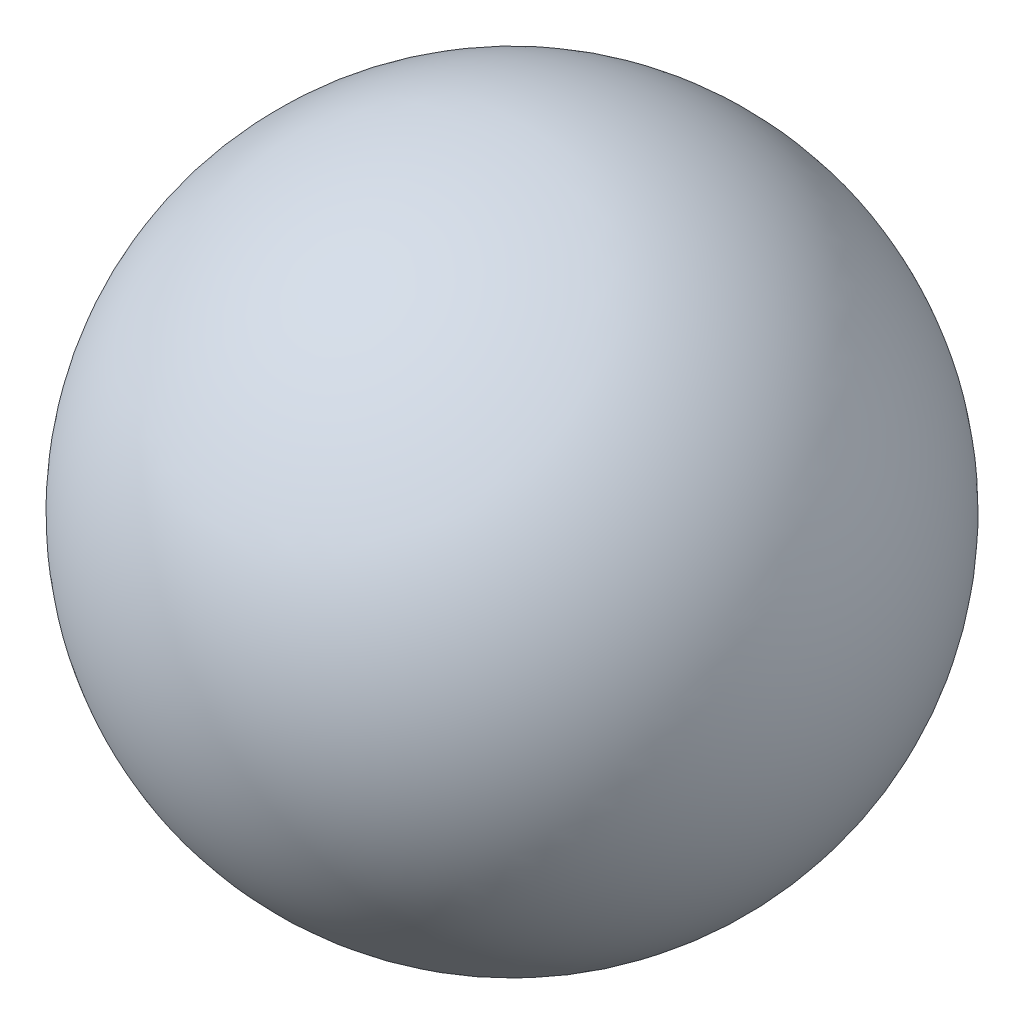
ISO-10303-21;
HEADER;
FILE_DESCRIPTION(('STEP AP214'),'2;1');
FILE_NAME('part.step','',(''),(''),'','','');
FILE_SCHEMA(('AUTOMOTIVE_DESIGN { 1 0 10303 214 1 1 1 1 }'));
ENDSEC;
DATA;
#1=APPLICATION_CONTEXT('core data for automotive mechanical design processes');
#2=APPLICATION_PROTOCOL_DEFINITION('international standard','automotive_design',2000,#1);
#3=PRODUCT_CONTEXT('',#1,'mechanical');
#4=PRODUCT('Part','Part','',(#3));
#5=PRODUCT_RELATED_PRODUCT_CATEGORY('part','',(#4));
#6=PRODUCT_DEFINITION_FORMATION('','',#4);
#7=PRODUCT_DEFINITION_CONTEXT('part definition',#1,'design');
#8=PRODUCT_DEFINITION('design','',#6,#7);
#9=PRODUCT_DEFINITION_SHAPE('','',#8);
#10=(LENGTH_UNIT() NAMED_UNIT(*) SI_UNIT(.MILLI.,.METRE.));
#11=(NAMED_UNIT(*) PLANE_ANGLE_UNIT() SI_UNIT($,.RADIAN.));
#12=(NAMED_UNIT(*) SI_UNIT($,.STERADIAN.) SOLID_ANGLE_UNIT());
#13=UNCERTAINTY_MEASURE_WITH_UNIT(LENGTH_MEASURE(1.E-05),#10,'distance_accuracy_value','');
#14=(GEOMETRIC_REPRESENTATION_CONTEXT(3) GLOBAL_UNCERTAINTY_ASSIGNED_CONTEXT((#13)) GLOBAL_UNIT_ASSIGNED_CONTEXT((#10,
#11,#12)) REPRESENTATION_CONTEXT('',''));
#15=CARTESIAN_POINT('',(0.,0.,0.));
#16=DIRECTION('',(0.,0.,1.));
#17=DIRECTION('',(1.,0.,0.));
#18=AXIS2_PLACEMENT_3D('',#15,#16,#17);
#19=CARTESIAN_POINT('',(0.,0.,0.));
#20=DIRECTION('',(0.,0.,1.));
#21=DIRECTION('',(1.,0.,0.));
#22=AXIS2_PLACEMENT_3D('',#19,#20,#21);
#23=SPHERICAL_SURFACE('',#22,129.54);
#24=CARTESIAN_POINT('',(0.,0.,129.54));
#25=VERTEX_POINT('',#24);
#26=VERTEX_LOOP('',#25);
#27=FACE_BOUND('',#26,.T.);
#28=ADVANCED_FACE('F30',(#27),#23,.T.);
#29=CLOSED_SHELL('',(#28));
#30=CARTESIAN_POINT('',(0.,0.,0.));
#31=DIRECTION('',(0.,0.,1.));
#32=DIRECTION('',(1.,0.,0.));
#33=AXIS2_PLACEMENT_3D('',#30,#31,#32);
#34=SPHERICAL_SURFACE('',#33,127.);
#35=CARTESIAN_POINT('',(0.,0.,127.));
#36=VERTEX_POINT('',#35);
#37=VERTEX_LOOP('',#36);
#38=FACE_BOUND('',#37,.T.);
#39=ADVANCED_FACE('F43',(#38),#34,.F.);
#40=CLOSED_SHELL('',(#39));
#41=ORIENTED_CLOSED_SHELL('',*,#40,.T.);
#42=BREP_WITH_VOIDS('B2',#29,(#41));
#43=ADVANCED_BREP_SHAPE_REPRESENTATION('',(#18,#42),#14);
#44=SHAPE_DEFINITION_REPRESENTATION(#9,#43);
ENDSEC;
END-ISO-10303-21;
